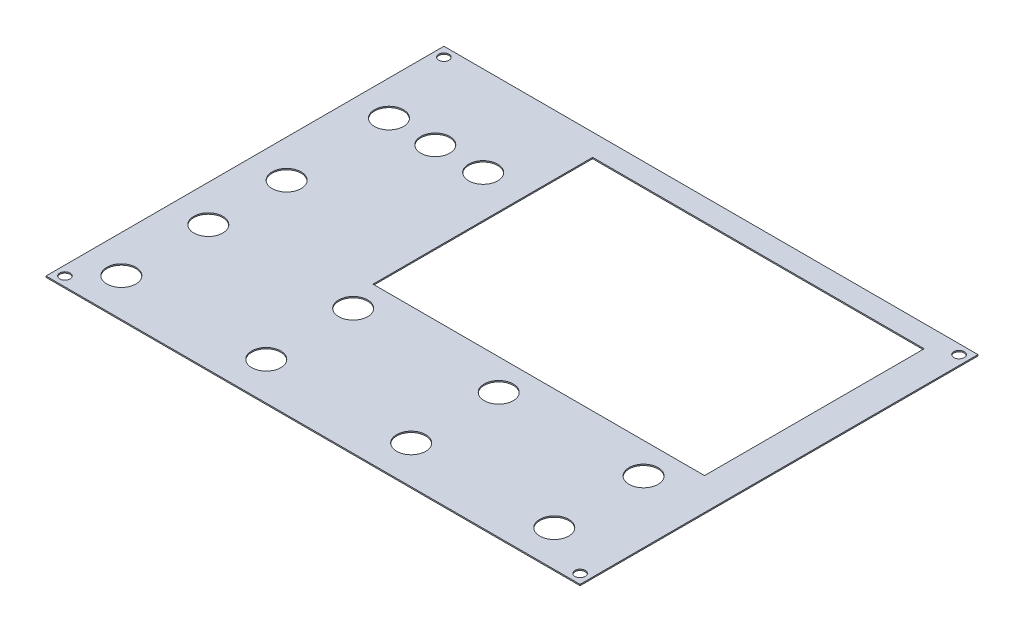
ISO-10303-21;
HEADER;
FILE_DESCRIPTION(('STEP AP214'),'2;1');
FILE_NAME('part.step','',(''),(''),'','','');
FILE_SCHEMA(('AUTOMOTIVE_DESIGN { 1 0 10303 214 1 1 1 1 }'));
ENDSEC;
DATA;
#1=APPLICATION_CONTEXT('core data for automotive mechanical design processes');
#2=APPLICATION_PROTOCOL_DEFINITION('international standard','automotive_design',2000,#1);
#3=PRODUCT_CONTEXT('',#1,'mechanical');
#4=PRODUCT('Part','Part','',(#3));
#5=PRODUCT_RELATED_PRODUCT_CATEGORY('part','',(#4));
#6=PRODUCT_DEFINITION_FORMATION('','',#4);
#7=PRODUCT_DEFINITION_CONTEXT('part definition',#1,'design');
#8=PRODUCT_DEFINITION('design','',#6,#7);
#9=PRODUCT_DEFINITION_SHAPE('','',#8);
#10=(LENGTH_UNIT() NAMED_UNIT(*) SI_UNIT(.MILLI.,.METRE.));
#11=(NAMED_UNIT(*) PLANE_ANGLE_UNIT() SI_UNIT($,.RADIAN.));
#12=(NAMED_UNIT(*) SI_UNIT($,.STERADIAN.) SOLID_ANGLE_UNIT());
#13=UNCERTAINTY_MEASURE_WITH_UNIT(LENGTH_MEASURE(1.E-05),#10,'distance_accuracy_value','');
#14=(GEOMETRIC_REPRESENTATION_CONTEXT(3) GLOBAL_UNCERTAINTY_ASSIGNED_CONTEXT((#13)) GLOBAL_UNIT_ASSIGNED_CONTEXT((#10,
#11,#12)) REPRESENTATION_CONTEXT('',''));
#15=CARTESIAN_POINT('',(0.,0.,0.));
#16=DIRECTION('',(0.,0.,1.));
#17=DIRECTION('',(1.,0.,0.));
#18=AXIS2_PLACEMENT_3D('',#15,#16,#17);
#19=CARTESIAN_POINT('',(0.,0.3,0.));
#20=DIRECTION('',(0.,-1.,0.));
#21=DIRECTION('',(0.,0.,-1.));
#22=AXIS2_PLACEMENT_3D('',#19,#20,#21);
#23=PLANE('',#22);
#24=CARTESIAN_POINT('',(28.83,0.3,-72.09));
#25=DIRECTION('',(0.,1.,0.));
#26=DIRECTION('',(0.,0.,1.));
#27=AXIS2_PLACEMENT_3D('',#24,#25,#26);
#28=CIRCLE('',#27,3.5);
#29=CARTESIAN_POINT('',(28.83,0.3,-68.59));
#30=VERTEX_POINT('',#29);
#31=EDGE_CURVE('E143',#30,#30,#28,.T.);
#32=ORIENTED_EDGE('',*,*,#31,.F.);
#33=EDGE_LOOP('',(#32));
#34=FACE_BOUND('',#33,.T.);
#35=CARTESIAN_POINT('',(17.272,0.3,-72.09));
#36=DIRECTION('',(0.,1.,0.));
#37=DIRECTION('',(0.,0.,1.));
#38=AXIS2_PLACEMENT_3D('',#35,#36,#37);
#39=CIRCLE('',#38,3.5);
#40=CARTESIAN_POINT('',(17.272,0.3,-68.59));
#41=VERTEX_POINT('',#40);
#42=EDGE_CURVE('E149',#41,#41,#39,.T.);
#43=ORIENTED_EDGE('',*,*,#42,.F.);
#44=EDGE_LOOP('',(#43));
#45=FACE_BOUND('',#44,.T.);
#46=CARTESIAN_POINT('',(6.09599999999999,0.3,-72.09));
#47=DIRECTION('',(0.,1.,0.));
#48=DIRECTION('',(0.,0.,1.));
#49=AXIS2_PLACEMENT_3D('',#46,#47,#48);
#50=CIRCLE('',#49,3.5);
#51=CARTESIAN_POINT('',(6.09599999999999,0.3,-68.59));
#52=VERTEX_POINT('',#51);
#53=EDGE_CURVE('E155',#52,#52,#50,.T.);
#54=ORIENTED_EDGE('',*,*,#53,.F.);
#55=EDGE_LOOP('',(#54));
#56=FACE_BOUND('',#55,.T.);
#57=CARTESIAN_POINT('',(111.601,0.3,-28.023));
#58=DIRECTION('',(0.,1.,0.));
#59=DIRECTION('',(0.,0.,1.));
#60=AXIS2_PLACEMENT_3D('',#57,#58,#59);
#61=CIRCLE('',#60,3.50000000000001);
#62=CARTESIAN_POINT('',(111.601,0.3,-24.523));
#63=VERTEX_POINT('',#62);
#64=EDGE_CURVE('E161',#63,#63,#61,.T.);
#65=ORIENTED_EDGE('',*,*,#64,.F.);
#66=EDGE_LOOP('',(#65));
#67=FACE_BOUND('',#66,.T.);
#68=CARTESIAN_POINT('',(76.645,0.3,-28.023));
#69=DIRECTION('',(0.,1.,0.));
#70=DIRECTION('',(0.,0.,1.));
#71=AXIS2_PLACEMENT_3D('',#68,#69,#70);
#72=CIRCLE('',#71,3.50000000000001);
#73=CARTESIAN_POINT('',(76.645,0.3,-24.523));
#74=VERTEX_POINT('',#73);
#75=EDGE_CURVE('E167',#74,#74,#72,.T.);
#76=ORIENTED_EDGE('',*,*,#75,.F.);
#77=EDGE_LOOP('',(#76));
#78=FACE_BOUND('',#77,.T.);
#79=CARTESIAN_POINT('',(41.524,0.3,-28.023));
#80=DIRECTION('',(0.,1.,0.));
#81=DIRECTION('',(0.,0.,1.));
#82=AXIS2_PLACEMENT_3D('',#79,#80,#81);
#83=CIRCLE('',#82,3.5);
#84=CARTESIAN_POINT('',(41.524,0.3,-24.523));
#85=VERTEX_POINT('',#84);
#86=EDGE_CURVE('E173',#85,#85,#83,.T.);
#87=ORIENTED_EDGE('',*,*,#86,.F.);
#88=EDGE_LOOP('',(#87));
#89=FACE_BOUND('',#88,.T.);
#90=CARTESIAN_POINT('',(6.56800000000001,0.3,-28.023));
#91=DIRECTION('',(0.,1.,0.));
#92=DIRECTION('',(0.,0.,1.));
#93=AXIS2_PLACEMENT_3D('',#90,#91,#92);
#94=CIRCLE('',#93,3.5);
#95=CARTESIAN_POINT('',(6.56800000000001,0.3,-24.523));
#96=VERTEX_POINT('',#95);
#97=EDGE_CURVE('E179',#96,#96,#94,.T.);
#98=ORIENTED_EDGE('',*,*,#97,.F.);
#99=EDGE_LOOP('',(#98));
#100=FACE_BOUND('',#99,.T.);
#101=CARTESIAN_POINT('',(6.73,0.3,-46.754));
#102=DIRECTION('',(0.,1.,0.));
#103=DIRECTION('',(0.,0.,1.));
#104=AXIS2_PLACEMENT_3D('',#101,#102,#103);
#105=CIRCLE('',#104,3.5);
#106=CARTESIAN_POINT('',(6.73,0.3,-43.254));
#107=VERTEX_POINT('',#106);
#108=EDGE_CURVE('E185',#107,#107,#105,.T.);
#109=ORIENTED_EDGE('',*,*,#108,.F.);
#110=EDGE_LOOP('',(#109));
#111=FACE_BOUND('',#110,.T.);
#112=CARTESIAN_POINT('',(111.63,0.3,-6.44));
#113=DIRECTION('',(0.,1.,0.));
#114=DIRECTION('',(0.,0.,1.));
#115=AXIS2_PLACEMENT_3D('',#112,#113,#114);
#116=CIRCLE('',#115,3.50000000000001);
#117=CARTESIAN_POINT('',(111.63,0.3,-2.93999999999999));
#118=VERTEX_POINT('',#117);
#119=EDGE_CURVE('E191',#118,#118,#116,.T.);
#120=ORIENTED_EDGE('',*,*,#119,.F.);
#121=EDGE_LOOP('',(#120));
#122=FACE_BOUND('',#121,.T.);
#123=CARTESIAN_POINT('',(76.663,0.3,-6.881));
#124=DIRECTION('',(0.,1.,0.));
#125=DIRECTION('',(0.,0.,1.));
#126=AXIS2_PLACEMENT_3D('',#123,#124,#125);
#127=CIRCLE('',#126,3.50000000000001);
#128=CARTESIAN_POINT('',(76.663,0.3,-3.38099999999999));
#129=VERTEX_POINT('',#128);
#130=EDGE_CURVE('E197',#129,#129,#127,.T.);
#131=ORIENTED_EDGE('',*,*,#130,.F.);
#132=EDGE_LOOP('',(#131));
#133=FACE_BOUND('',#132,.T.);
#134=CARTESIAN_POINT('',(41.697,0.3,-6.881));
#135=DIRECTION('',(0.,1.,0.));
#136=DIRECTION('',(0.,0.,1.));
#137=AXIS2_PLACEMENT_3D('',#134,#135,#136);
#138=CIRCLE('',#137,3.5);
#139=CARTESIAN_POINT('',(41.697,0.3,-3.381));
#140=VERTEX_POINT('',#139);
#141=EDGE_CURVE('E203',#140,#140,#138,.T.);
#142=ORIENTED_EDGE('',*,*,#141,.F.);
#143=EDGE_LOOP('',(#142));
#144=FACE_BOUND('',#143,.T.);
#145=CARTESIAN_POINT('',(6.731,0.3,-6.881));
#146=DIRECTION('',(0.,1.,0.));
#147=DIRECTION('',(0.,0.,1.));
#148=AXIS2_PLACEMENT_3D('',#145,#146,#147);
#149=CIRCLE('',#148,3.5);
#150=CARTESIAN_POINT('',(6.731,0.3,-3.381));
#151=VERTEX_POINT('',#150);
#152=EDGE_CURVE('E209',#151,#151,#149,.T.);
#153=ORIENTED_EDGE('',*,*,#152,.F.);
#154=EDGE_LOOP('',(#153));
#155=FACE_BOUND('',#154,.T.);
#156=CARTESIAN_POINT('',(124.3,0.3,0.));
#157=DIRECTION('',(0.,1.,0.));
#158=DIRECTION('',(0.,0.,1.));
#159=AXIS2_PLACEMENT_3D('',#156,#157,#158);
#160=CIRCLE('',#159,1.25000000000001);
#161=CARTESIAN_POINT('',(124.3,0.3,1.25000000000001));
#162=VERTEX_POINT('',#161);
#163=EDGE_CURVE('E215',#162,#162,#160,.T.);
#164=ORIENTED_EDGE('',*,*,#163,.F.);
#165=EDGE_LOOP('',(#164));
#166=FACE_BOUND('',#165,.T.);
#167=CARTESIAN_POINT('',(0.,0.3,0.));
#168=DIRECTION('',(0.,1.,0.));
#169=DIRECTION('',(0.,0.,1.));
#170=AXIS2_PLACEMENT_3D('',#167,#168,#169);
#171=CIRCLE('',#170,1.25);
#172=CARTESIAN_POINT('',(0.,0.3,1.25));
#173=VERTEX_POINT('',#172);
#174=EDGE_CURVE('E221',#173,#173,#171,.T.);
#175=ORIENTED_EDGE('',*,*,#174,.F.);
#176=EDGE_LOOP('',(#175));
#177=FACE_BOUND('',#176,.T.);
#178=CARTESIAN_POINT('',(124.3,0.3,-91.44));
#179=DIRECTION('',(0.,1.,0.));
#180=DIRECTION('',(0.,0.,1.));
#181=AXIS2_PLACEMENT_3D('',#178,#179,#180);
#182=CIRCLE('',#181,1.25000000000001);
#183=CARTESIAN_POINT('',(124.3,0.3,-90.19));
#184=VERTEX_POINT('',#183);
#185=EDGE_CURVE('E227',#184,#184,#182,.T.);
#186=ORIENTED_EDGE('',*,*,#185,.F.);
#187=EDGE_LOOP('',(#186));
#188=FACE_BOUND('',#187,.T.);
#189=CARTESIAN_POINT('',(0.,0.3,-91.44));
#190=DIRECTION('',(0.,1.,0.));
#191=DIRECTION('',(0.,0.,1.));
#192=AXIS2_PLACEMENT_3D('',#189,#190,#191);
#193=CIRCLE('',#192,1.25);
#194=CARTESIAN_POINT('',(0.,0.3,-90.19));
#195=VERTEX_POINT('',#194);
#196=EDGE_CURVE('E233',#195,#195,#193,.T.);
#197=ORIENTED_EDGE('',*,*,#196,.F.);
#198=EDGE_LOOP('',(#197));
#199=FACE_BOUND('',#198,.T.);
#200=DIRECTION('',(0.,0.,1.));
#201=VECTOR('',#200,1.);
#202=CARTESIAN_POINT('',(-2.286,0.3,2.286));
#203=LINE('',#202,#201);
#204=CARTESIAN_POINT('',(-2.286,0.3,-93.726));
#205=VERTEX_POINT('',#204);
#206=CARTESIAN_POINT('',(-2.286,0.3,2.286));
#207=VERTEX_POINT('',#206);
#208=EDGE_CURVE('E239',#205,#207,#203,.T.);
#209=ORIENTED_EDGE('',*,*,#208,.T.);
#210=DIRECTION('',(1.,0.,0.));
#211=VECTOR('',#210,1.);
#212=CARTESIAN_POINT('',(-2.286,0.3,2.286));
#213=LINE('',#212,#211);
#214=CARTESIAN_POINT('',(126.586,0.3,2.286));
#215=VERTEX_POINT('',#214);
#216=EDGE_CURVE('E242',#207,#215,#213,.T.);
#217=ORIENTED_EDGE('',*,*,#216,.T.);
#218=DIRECTION('',(0.,0.,-1.));
#219=VECTOR('',#218,1.);
#220=CARTESIAN_POINT('',(126.586,0.3,2.286));
#221=LINE('',#220,#219);
#222=CARTESIAN_POINT('',(126.586,0.3,-93.726));
#223=VERTEX_POINT('',#222);
#224=EDGE_CURVE('E245',#215,#223,#221,.T.);
#225=ORIENTED_EDGE('',*,*,#224,.T.);
#226=DIRECTION('',(-1.,0.,0.));
#227=VECTOR('',#226,1.);
#228=CARTESIAN_POINT('',(-2.286,0.3,-93.726));
#229=LINE('',#228,#227);
#230=EDGE_CURVE('E247',#223,#205,#229,.T.);
#231=ORIENTED_EDGE('',*,*,#230,.T.);
#232=EDGE_LOOP('',(#209,#217,#225,#231));
#233=FACE_BOUND('',#232,.T.);
#234=DIRECTION('',(0.,0.,1.));
#235=VECTOR('',#234,1.);
#236=CARTESIAN_POINT('',(38.875410922835,0.3,-88.4519872714323));
#237=LINE('',#236,#235);
#238=CARTESIAN_POINT('',(38.875410922835,0.3,-88.4519872714323));
#239=VERTEX_POINT('',#238);
#240=CARTESIAN_POINT('',(38.875410922835,0.3,-35.4519872714323));
#241=VERTEX_POINT('',#240);
#242=EDGE_CURVE('E107',#239,#241,#237,.T.);
#243=ORIENTED_EDGE('',*,*,#242,.F.);
#244=DIRECTION('',(-1.,0.,0.));
#245=VECTOR('',#244,1.);
#246=CARTESIAN_POINT('',(38.875410922835,0.3,-88.4519872714323));
#247=LINE('',#246,#245);
#248=CARTESIAN_POINT('',(118.875410922835,0.3,-88.4519872714323));
#249=VERTEX_POINT('',#248);
#250=EDGE_CURVE('E129',#249,#239,#247,.T.);
#251=ORIENTED_EDGE('',*,*,#250,.F.);
#252=DIRECTION('',(0.,0.,-1.));
#253=VECTOR('',#252,1.);
#254=CARTESIAN_POINT('',(118.875410922835,0.3,-88.4519872714323));
#255=LINE('',#254,#253);
#256=CARTESIAN_POINT('',(118.875410922835,0.3,-35.4519872714323));
#257=VERTEX_POINT('',#256);
#258=EDGE_CURVE('E127',#257,#249,#255,.T.);
#259=ORIENTED_EDGE('',*,*,#258,.F.);
#260=DIRECTION('',(1.,0.,0.));
#261=VECTOR('',#260,1.);
#262=CARTESIAN_POINT('',(38.875410922835,0.3,-35.4519872714323));
#263=LINE('',#262,#261);
#264=EDGE_CURVE('E115',#241,#257,#263,.T.);
#265=ORIENTED_EDGE('',*,*,#264,.F.);
#266=EDGE_LOOP('',(#243,#251,#259,#265));
#267=FACE_BOUND('',#266,.T.);
#268=ADVANCED_FACE('F42',(#34,#45,#56,#67,#78,#89,#100,#111,#122,#133,#144,#155,#166,#177,#188,
#199,#233,#267),#23,.F.);
#269=CARTESIAN_POINT('',(0.,0.,0.));
#270=DIRECTION('',(0.,-1.,0.));
#271=DIRECTION('',(0.,0.,-1.));
#272=AXIS2_PLACEMENT_3D('',#269,#270,#271);
#273=PLANE('',#272);
#274=CARTESIAN_POINT('',(17.272,0.,-72.09));
#275=DIRECTION('',(0.,1.,0.));
#276=DIRECTION('',(0.,0.,1.));
#277=AXIS2_PLACEMENT_3D('',#274,#275,#276);
#278=CIRCLE('',#277,3.5);
#279=CARTESIAN_POINT('',(17.272,0.,-68.59));
#280=VERTEX_POINT('',#279);
#281=EDGE_CURVE('E146',#280,#280,#278,.T.);
#282=ORIENTED_EDGE('',*,*,#281,.T.);
#283=EDGE_LOOP('',(#282));
#284=FACE_BOUND('',#283,.T.);
#285=CARTESIAN_POINT('',(111.601,0.,-28.023));
#286=DIRECTION('',(0.,1.,0.));
#287=DIRECTION('',(0.,0.,1.));
#288=AXIS2_PLACEMENT_3D('',#285,#286,#287);
#289=CIRCLE('',#288,3.50000000000001);
#290=CARTESIAN_POINT('',(111.601,0.,-24.523));
#291=VERTEX_POINT('',#290);
#292=EDGE_CURVE('E158',#291,#291,#289,.T.);
#293=ORIENTED_EDGE('',*,*,#292,.T.);
#294=EDGE_LOOP('',(#293));
#295=FACE_BOUND('',#294,.T.);
#296=CARTESIAN_POINT('',(41.524,0.,-28.023));
#297=DIRECTION('',(0.,1.,0.));
#298=DIRECTION('',(0.,0.,1.));
#299=AXIS2_PLACEMENT_3D('',#296,#297,#298);
#300=CIRCLE('',#299,3.5);
#301=CARTESIAN_POINT('',(41.524,0.,-24.523));
#302=VERTEX_POINT('',#301);
#303=EDGE_CURVE('E170',#302,#302,#300,.T.);
#304=ORIENTED_EDGE('',*,*,#303,.T.);
#305=EDGE_LOOP('',(#304));
#306=FACE_BOUND('',#305,.T.);
#307=CARTESIAN_POINT('',(6.73,0.,-46.754));
#308=DIRECTION('',(0.,1.,0.));
#309=DIRECTION('',(0.,0.,1.));
#310=AXIS2_PLACEMENT_3D('',#307,#308,#309);
#311=CIRCLE('',#310,3.5);
#312=CARTESIAN_POINT('',(6.73,0.,-43.254));
#313=VERTEX_POINT('',#312);
#314=EDGE_CURVE('E182',#313,#313,#311,.T.);
#315=ORIENTED_EDGE('',*,*,#314,.T.);
#316=EDGE_LOOP('',(#315));
#317=FACE_BOUND('',#316,.T.);
#318=CARTESIAN_POINT('',(76.663,0.,-6.881));
#319=DIRECTION('',(0.,1.,0.));
#320=DIRECTION('',(0.,0.,1.));
#321=AXIS2_PLACEMENT_3D('',#318,#319,#320);
#322=CIRCLE('',#321,3.50000000000001);
#323=CARTESIAN_POINT('',(76.663,0.,-3.38099999999999));
#324=VERTEX_POINT('',#323);
#325=EDGE_CURVE('E194',#324,#324,#322,.T.);
#326=ORIENTED_EDGE('',*,*,#325,.T.);
#327=EDGE_LOOP('',(#326));
#328=FACE_BOUND('',#327,.T.);
#329=CARTESIAN_POINT('',(6.731,0.,-6.881));
#330=DIRECTION('',(0.,1.,0.));
#331=DIRECTION('',(0.,0.,1.));
#332=AXIS2_PLACEMENT_3D('',#329,#330,#331);
#333=CIRCLE('',#332,3.5);
#334=CARTESIAN_POINT('',(6.731,0.,-3.381));
#335=VERTEX_POINT('',#334);
#336=EDGE_CURVE('E206',#335,#335,#333,.T.);
#337=ORIENTED_EDGE('',*,*,#336,.T.);
#338=EDGE_LOOP('',(#337));
#339=FACE_BOUND('',#338,.T.);
#340=CARTESIAN_POINT('',(0.,0.,0.));
#341=DIRECTION('',(0.,1.,0.));
#342=DIRECTION('',(0.,0.,1.));
#343=AXIS2_PLACEMENT_3D('',#340,#341,#342);
#344=CIRCLE('',#343,1.25);
#345=CARTESIAN_POINT('',(0.,0.,1.25));
#346=VERTEX_POINT('',#345);
#347=EDGE_CURVE('E218',#346,#346,#344,.T.);
#348=ORIENTED_EDGE('',*,*,#347,.T.);
#349=EDGE_LOOP('',(#348));
#350=FACE_BOUND('',#349,.T.);
#351=CARTESIAN_POINT('',(0.,0.,-91.44));
#352=DIRECTION('',(0.,1.,0.));
#353=DIRECTION('',(0.,0.,1.));
#354=AXIS2_PLACEMENT_3D('',#351,#352,#353);
#355=CIRCLE('',#354,1.25);
#356=CARTESIAN_POINT('',(0.,0.,-90.19));
#357=VERTEX_POINT('',#356);
#358=EDGE_CURVE('E230',#357,#357,#355,.T.);
#359=ORIENTED_EDGE('',*,*,#358,.T.);
#360=EDGE_LOOP('',(#359));
#361=FACE_BOUND('',#360,.T.);
#362=DIRECTION('',(0.,0.,1.));
#363=VECTOR('',#362,1.);
#364=CARTESIAN_POINT('',(-2.286,0.,2.286));
#365=LINE('',#364,#363);
#366=CARTESIAN_POINT('',(-2.286,0.,-93.726));
#367=VERTEX_POINT('',#366);
#368=CARTESIAN_POINT('',(-2.286,0.,2.286));
#369=VERTEX_POINT('',#368);
#370=EDGE_CURVE('E236',#367,#369,#365,.T.);
#371=ORIENTED_EDGE('',*,*,#370,.F.);
#372=DIRECTION('',(-1.,0.,0.));
#373=VECTOR('',#372,1.);
#374=CARTESIAN_POINT('',(-2.286,0.,-93.726));
#375=LINE('',#374,#373);
#376=CARTESIAN_POINT('',(126.586,0.,-93.726));
#377=VERTEX_POINT('',#376);
#378=EDGE_CURVE('E243',#377,#367,#375,.T.);
#379=ORIENTED_EDGE('',*,*,#378,.F.);
#380=DIRECTION('',(0.,0.,-1.));
#381=VECTOR('',#380,1.);
#382=CARTESIAN_POINT('',(126.586,0.,2.286));
#383=LINE('',#382,#381);
#384=CARTESIAN_POINT('',(126.586,0.,2.286));
#385=VERTEX_POINT('',#384);
#386=EDGE_CURVE('E254',#385,#377,#383,.T.);
#387=ORIENTED_EDGE('',*,*,#386,.F.);
#388=DIRECTION('',(1.,0.,0.));
#389=VECTOR('',#388,1.);
#390=CARTESIAN_POINT('',(-2.286,0.,2.286));
#391=LINE('',#390,#389);
#392=EDGE_CURVE('E252',#369,#385,#391,.T.);
#393=ORIENTED_EDGE('',*,*,#392,.F.);
#394=EDGE_LOOP('',(#371,#379,#387,#393));
#395=FACE_BOUND('',#394,.T.);
#396=CARTESIAN_POINT('',(124.3,0.,-91.44));
#397=DIRECTION('',(0.,1.,0.));
#398=DIRECTION('',(0.,0.,1.));
#399=AXIS2_PLACEMENT_3D('',#396,#397,#398);
#400=CIRCLE('',#399,1.25000000000001);
#401=CARTESIAN_POINT('',(124.3,0.,-90.19));
#402=VERTEX_POINT('',#401);
#403=EDGE_CURVE('E224',#402,#402,#400,.T.);
#404=ORIENTED_EDGE('',*,*,#403,.T.);
#405=EDGE_LOOP('',(#404));
#406=FACE_BOUND('',#405,.T.);
#407=CARTESIAN_POINT('',(124.3,0.,0.));
#408=DIRECTION('',(0.,1.,0.));
#409=DIRECTION('',(0.,0.,1.));
#410=AXIS2_PLACEMENT_3D('',#407,#408,#409);
#411=CIRCLE('',#410,1.25000000000001);
#412=CARTESIAN_POINT('',(124.3,0.,1.25000000000001));
#413=VERTEX_POINT('',#412);
#414=EDGE_CURVE('E212',#413,#413,#411,.T.);
#415=ORIENTED_EDGE('',*,*,#414,.T.);
#416=EDGE_LOOP('',(#415));
#417=FACE_BOUND('',#416,.T.);
#418=CARTESIAN_POINT('',(41.697,0.,-6.881));
#419=DIRECTION('',(0.,1.,0.));
#420=DIRECTION('',(0.,0.,1.));
#421=AXIS2_PLACEMENT_3D('',#418,#419,#420);
#422=CIRCLE('',#421,3.5);
#423=CARTESIAN_POINT('',(41.697,0.,-3.381));
#424=VERTEX_POINT('',#423);
#425=EDGE_CURVE('E200',#424,#424,#422,.T.);
#426=ORIENTED_EDGE('',*,*,#425,.T.);
#427=EDGE_LOOP('',(#426));
#428=FACE_BOUND('',#427,.T.);
#429=CARTESIAN_POINT('',(111.63,0.,-6.44));
#430=DIRECTION('',(0.,1.,0.));
#431=DIRECTION('',(0.,0.,1.));
#432=AXIS2_PLACEMENT_3D('',#429,#430,#431);
#433=CIRCLE('',#432,3.50000000000001);
#434=CARTESIAN_POINT('',(111.63,0.,-2.93999999999999));
#435=VERTEX_POINT('',#434);
#436=EDGE_CURVE('E188',#435,#435,#433,.T.);
#437=ORIENTED_EDGE('',*,*,#436,.T.);
#438=EDGE_LOOP('',(#437));
#439=FACE_BOUND('',#438,.T.);
#440=CARTESIAN_POINT('',(6.56800000000001,0.,-28.023));
#441=DIRECTION('',(0.,1.,0.));
#442=DIRECTION('',(0.,0.,1.));
#443=AXIS2_PLACEMENT_3D('',#440,#441,#442);
#444=CIRCLE('',#443,3.5);
#445=CARTESIAN_POINT('',(6.56800000000001,0.,-24.523));
#446=VERTEX_POINT('',#445);
#447=EDGE_CURVE('E176',#446,#446,#444,.T.);
#448=ORIENTED_EDGE('',*,*,#447,.T.);
#449=EDGE_LOOP('',(#448));
#450=FACE_BOUND('',#449,.T.);
#451=CARTESIAN_POINT('',(76.645,0.,-28.023));
#452=DIRECTION('',(0.,1.,0.));
#453=DIRECTION('',(0.,0.,1.));
#454=AXIS2_PLACEMENT_3D('',#451,#452,#453);
#455=CIRCLE('',#454,3.50000000000001);
#456=CARTESIAN_POINT('',(76.645,0.,-24.523));
#457=VERTEX_POINT('',#456);
#458=EDGE_CURVE('E164',#457,#457,#455,.T.);
#459=ORIENTED_EDGE('',*,*,#458,.T.);
#460=EDGE_LOOP('',(#459));
#461=FACE_BOUND('',#460,.T.);
#462=CARTESIAN_POINT('',(6.09599999999999,0.,-72.09));
#463=DIRECTION('',(0.,1.,0.));
#464=DIRECTION('',(0.,0.,1.));
#465=AXIS2_PLACEMENT_3D('',#462,#463,#464);
#466=CIRCLE('',#465,3.5);
#467=CARTESIAN_POINT('',(6.09599999999999,0.,-68.59));
#468=VERTEX_POINT('',#467);
#469=EDGE_CURVE('E152',#468,#468,#466,.T.);
#470=ORIENTED_EDGE('',*,*,#469,.T.);
#471=EDGE_LOOP('',(#470));
#472=FACE_BOUND('',#471,.T.);
#473=CARTESIAN_POINT('',(28.83,0.,-72.09));
#474=DIRECTION('',(0.,1.,0.));
#475=DIRECTION('',(0.,0.,1.));
#476=AXIS2_PLACEMENT_3D('',#473,#474,#475);
#477=CIRCLE('',#476,3.5);
#478=CARTESIAN_POINT('',(28.83,0.,-68.59));
#479=VERTEX_POINT('',#478);
#480=EDGE_CURVE('E123',#479,#479,#477,.T.);
#481=ORIENTED_EDGE('',*,*,#480,.T.);
#482=EDGE_LOOP('',(#481));
#483=FACE_BOUND('',#482,.T.);
#484=DIRECTION('',(-1.,0.,0.));
#485=VECTOR('',#484,1.);
#486=CARTESIAN_POINT('',(38.875410922835,0.,-88.4519872714323));
#487=LINE('',#486,#485);
#488=CARTESIAN_POINT('',(118.875410922835,0.,-88.4519872714323));
#489=VERTEX_POINT('',#488);
#490=CARTESIAN_POINT('',(38.875410922835,0.,-88.4519872714323));
#491=VERTEX_POINT('',#490);
#492=EDGE_CURVE('E116',#489,#491,#487,.T.);
#493=ORIENTED_EDGE('',*,*,#492,.T.);
#494=DIRECTION('',(0.,0.,1.));
#495=VECTOR('',#494,1.);
#496=CARTESIAN_POINT('',(38.875410922835,0.,-88.4519872714323));
#497=LINE('',#496,#495);
#498=CARTESIAN_POINT('',(38.875410922835,0.,-35.4519872714323));
#499=VERTEX_POINT('',#498);
#500=EDGE_CURVE('E65',#491,#499,#497,.T.);
#501=ORIENTED_EDGE('',*,*,#500,.T.);
#502=DIRECTION('',(1.,0.,0.));
#503=VECTOR('',#502,1.);
#504=CARTESIAN_POINT('',(38.875410922835,0.,-35.4519872714323));
#505=LINE('',#504,#503);
#506=CARTESIAN_POINT('',(118.875410922835,0.,-35.4519872714323));
#507=VERTEX_POINT('',#506);
#508=EDGE_CURVE('E122',#499,#507,#505,.T.);
#509=ORIENTED_EDGE('',*,*,#508,.T.);
#510=DIRECTION('',(0.,0.,-1.));
#511=VECTOR('',#510,1.);
#512=CARTESIAN_POINT('',(118.875410922835,0.,-88.4519872714323));
#513=LINE('',#512,#511);
#514=EDGE_CURVE('E135',#507,#489,#513,.T.);
#515=ORIENTED_EDGE('',*,*,#514,.T.);
#516=EDGE_LOOP('',(#493,#501,#509,#515));
#517=FACE_BOUND('',#516,.T.);
#518=ADVANCED_FACE('F272',(#284,#295,#306,#317,#328,#339,#350,#361,#395,#406,#417,#428,#439,
#450,#461,#472,#483,#517),#273,.T.);
#519=CARTESIAN_POINT('',(-2.286,0.3,2.286));
#520=DIRECTION('',(1.,0.,0.));
#521=DIRECTION('',(0.,0.,-1.));
#522=AXIS2_PLACEMENT_3D('',#519,#520,#521);
#523=PLANE('',#522);
#524=ORIENTED_EDGE('',*,*,#370,.T.);
#525=DIRECTION('',(0.,-1.,0.));
#526=VECTOR('',#525,1.);
#527=CARTESIAN_POINT('',(-2.286,0.3,2.286));
#528=LINE('',#527,#526);
#529=EDGE_CURVE('E11',#207,#369,#528,.T.);
#530=ORIENTED_EDGE('',*,*,#529,.F.);
#531=ORIENTED_EDGE('',*,*,#208,.F.);
#532=DIRECTION('',(0.,-1.,0.));
#533=VECTOR('',#532,1.);
#534=CARTESIAN_POINT('',(-2.286,0.3,-93.726));
#535=LINE('',#534,#533);
#536=EDGE_CURVE('E249',#205,#367,#535,.T.);
#537=ORIENTED_EDGE('',*,*,#536,.T.);
#538=EDGE_LOOP('',(#524,#530,#531,#537));
#539=FACE_BOUND('',#538,.T.);
#540=ADVANCED_FACE('F44',(#539),#523,.F.);
#541=CARTESIAN_POINT('',(-2.286,0.3,2.286));
#542=DIRECTION('',(0.,0.,-1.));
#543=DIRECTION('',(-1.,0.,0.));
#544=AXIS2_PLACEMENT_3D('',#541,#542,#543);
#545=PLANE('',#544);
#546=ORIENTED_EDGE('',*,*,#392,.T.);
#547=DIRECTION('',(0.,-1.,0.));
#548=VECTOR('',#547,1.);
#549=CARTESIAN_POINT('',(126.586,0.3,2.286));
#550=LINE('',#549,#548);
#551=EDGE_CURVE('E50',#215,#385,#550,.T.);
#552=ORIENTED_EDGE('',*,*,#551,.F.);
#553=ORIENTED_EDGE('',*,*,#216,.F.);
#554=ORIENTED_EDGE('',*,*,#529,.T.);
#555=EDGE_LOOP('',(#546,#552,#553,#554));
#556=FACE_BOUND('',#555,.T.);
#557=ADVANCED_FACE('F282',(#556),#545,.F.);
#558=CARTESIAN_POINT('',(126.586,0.3,2.286));
#559=DIRECTION('',(-1.,0.,0.));
#560=DIRECTION('',(0.,0.,1.));
#561=AXIS2_PLACEMENT_3D('',#558,#559,#560);
#562=PLANE('',#561);
#563=ORIENTED_EDGE('',*,*,#386,.T.);
#564=DIRECTION('',(0.,-1.,0.));
#565=VECTOR('',#564,1.);
#566=CARTESIAN_POINT('',(126.586,0.3,-93.726));
#567=LINE('',#566,#565);
#568=EDGE_CURVE('E259',#223,#377,#567,.T.);
#569=ORIENTED_EDGE('',*,*,#568,.F.);
#570=ORIENTED_EDGE('',*,*,#224,.F.);
#571=ORIENTED_EDGE('',*,*,#551,.T.);
#572=EDGE_LOOP('',(#563,#569,#570,#571));
#573=FACE_BOUND('',#572,.T.);
#574=ADVANCED_FACE('F266',(#573),#562,.F.);
#575=CARTESIAN_POINT('',(-2.286,0.3,-93.726));
#576=DIRECTION('',(0.,0.,1.));
#577=DIRECTION('',(1.,0.,0.));
#578=AXIS2_PLACEMENT_3D('',#575,#576,#577);
#579=PLANE('',#578);
#580=ORIENTED_EDGE('',*,*,#378,.T.);
#581=ORIENTED_EDGE('',*,*,#536,.F.);
#582=ORIENTED_EDGE('',*,*,#230,.F.);
#583=ORIENTED_EDGE('',*,*,#568,.T.);
#584=EDGE_LOOP('',(#580,#581,#582,#583));
#585=FACE_BOUND('',#584,.T.);
#586=ADVANCED_FACE('F276',(#585),#579,.F.);
#587=CARTESIAN_POINT('',(0.,0.3,-91.44));
#588=DIRECTION('',(0.,-1.,0.));
#589=DIRECTION('',(0.,0.,-1.));
#590=AXIS2_PLACEMENT_3D('',#587,#588,#589);
#591=CYLINDRICAL_SURFACE('',#590,1.25);
#592=ORIENTED_EDGE('',*,*,#196,.T.);
#593=EDGE_LOOP('',(#592));
#594=FACE_BOUND('',#593,.T.);
#595=ORIENTED_EDGE('',*,*,#358,.F.);
#596=EDGE_LOOP('',(#595));
#597=FACE_BOUND('',#596,.T.);
#598=ADVANCED_FACE('F300',(#594,#597),#591,.F.);
#599=CARTESIAN_POINT('',(124.3,0.3,-91.44));
#600=DIRECTION('',(0.,-1.,0.));
#601=DIRECTION('',(0.,0.,-1.));
#602=AXIS2_PLACEMENT_3D('',#599,#600,#601);
#603=CYLINDRICAL_SURFACE('',#602,1.25000000000001);
#604=ORIENTED_EDGE('',*,*,#185,.T.);
#605=EDGE_LOOP('',(#604));
#606=FACE_BOUND('',#605,.T.);
#607=ORIENTED_EDGE('',*,*,#403,.F.);
#608=EDGE_LOOP('',(#607));
#609=FACE_BOUND('',#608,.T.);
#610=ADVANCED_FACE('F307',(#606,#609),#603,.F.);
#611=CARTESIAN_POINT('',(0.,0.3,0.));
#612=DIRECTION('',(0.,-1.,0.));
#613=DIRECTION('',(0.,0.,-1.));
#614=AXIS2_PLACEMENT_3D('',#611,#612,#613);
#615=CYLINDRICAL_SURFACE('',#614,1.25);
#616=ORIENTED_EDGE('',*,*,#174,.T.);
#617=EDGE_LOOP('',(#616));
#618=FACE_BOUND('',#617,.T.);
#619=ORIENTED_EDGE('',*,*,#347,.F.);
#620=EDGE_LOOP('',(#619));
#621=FACE_BOUND('',#620,.T.);
#622=ADVANCED_FACE('F312',(#618,#621),#615,.F.);
#623=CARTESIAN_POINT('',(124.3,0.3,0.));
#624=DIRECTION('',(0.,-1.,0.));
#625=DIRECTION('',(0.,0.,-1.));
#626=AXIS2_PLACEMENT_3D('',#623,#624,#625);
#627=CYLINDRICAL_SURFACE('',#626,1.25000000000001);
#628=ORIENTED_EDGE('',*,*,#163,.T.);
#629=EDGE_LOOP('',(#628));
#630=FACE_BOUND('',#629,.T.);
#631=ORIENTED_EDGE('',*,*,#414,.F.);
#632=EDGE_LOOP('',(#631));
#633=FACE_BOUND('',#632,.T.);
#634=ADVANCED_FACE('F322',(#630,#633),#627,.F.);
#635=CARTESIAN_POINT('',(6.731,0.3,-6.881));
#636=DIRECTION('',(0.,-1.,0.));
#637=DIRECTION('',(0.,0.,-1.));
#638=AXIS2_PLACEMENT_3D('',#635,#636,#637);
#639=CYLINDRICAL_SURFACE('',#638,3.5);
#640=ORIENTED_EDGE('',*,*,#152,.T.);
#641=EDGE_LOOP('',(#640));
#642=FACE_BOUND('',#641,.T.);
#643=ORIENTED_EDGE('',*,*,#336,.F.);
#644=EDGE_LOOP('',(#643));
#645=FACE_BOUND('',#644,.T.);
#646=ADVANCED_FACE('F329',(#642,#645),#639,.F.);
#647=CARTESIAN_POINT('',(41.697,0.3,-6.881));
#648=DIRECTION('',(0.,-1.,0.));
#649=DIRECTION('',(0.,0.,-1.));
#650=AXIS2_PLACEMENT_3D('',#647,#648,#649);
#651=CYLINDRICAL_SURFACE('',#650,3.5);
#652=ORIENTED_EDGE('',*,*,#141,.T.);
#653=EDGE_LOOP('',(#652));
#654=FACE_BOUND('',#653,.T.);
#655=ORIENTED_EDGE('',*,*,#425,.F.);
#656=EDGE_LOOP('',(#655));
#657=FACE_BOUND('',#656,.T.);
#658=ADVANCED_FACE('F333',(#654,#657),#651,.F.);
#659=CARTESIAN_POINT('',(76.663,0.3,-6.881));
#660=DIRECTION('',(0.,-1.,0.));
#661=DIRECTION('',(0.,0.,-1.));
#662=AXIS2_PLACEMENT_3D('',#659,#660,#661);
#663=CYLINDRICAL_SURFACE('',#662,3.50000000000001);
#664=ORIENTED_EDGE('',*,*,#130,.T.);
#665=EDGE_LOOP('',(#664));
#666=FACE_BOUND('',#665,.T.);
#667=ORIENTED_EDGE('',*,*,#325,.F.);
#668=EDGE_LOOP('',(#667));
#669=FACE_BOUND('',#668,.T.);
#670=ADVANCED_FACE('F337',(#666,#669),#663,.F.);
#671=CARTESIAN_POINT('',(111.63,0.3,-6.44));
#672=DIRECTION('',(0.,-1.,0.));
#673=DIRECTION('',(0.,0.,-1.));
#674=AXIS2_PLACEMENT_3D('',#671,#672,#673);
#675=CYLINDRICAL_SURFACE('',#674,3.50000000000001);
#676=ORIENTED_EDGE('',*,*,#119,.T.);
#677=EDGE_LOOP('',(#676));
#678=FACE_BOUND('',#677,.T.);
#679=ORIENTED_EDGE('',*,*,#436,.F.);
#680=EDGE_LOOP('',(#679));
#681=FACE_BOUND('',#680,.T.);
#682=ADVANCED_FACE('F341',(#678,#681),#675,.F.);
#683=CARTESIAN_POINT('',(6.73,0.3,-46.754));
#684=DIRECTION('',(0.,-1.,0.));
#685=DIRECTION('',(0.,0.,-1.));
#686=AXIS2_PLACEMENT_3D('',#683,#684,#685);
#687=CYLINDRICAL_SURFACE('',#686,3.5);
#688=ORIENTED_EDGE('',*,*,#108,.T.);
#689=EDGE_LOOP('',(#688));
#690=FACE_BOUND('',#689,.T.);
#691=ORIENTED_EDGE('',*,*,#314,.F.);
#692=EDGE_LOOP('',(#691));
#693=FACE_BOUND('',#692,.T.);
#694=ADVANCED_FACE('F345',(#690,#693),#687,.F.);
#695=CARTESIAN_POINT('',(6.56800000000001,0.3,-28.023));
#696=DIRECTION('',(0.,-1.,0.));
#697=DIRECTION('',(0.,0.,-1.));
#698=AXIS2_PLACEMENT_3D('',#695,#696,#697);
#699=CYLINDRICAL_SURFACE('',#698,3.5);
#700=ORIENTED_EDGE('',*,*,#97,.T.);
#701=EDGE_LOOP('',(#700));
#702=FACE_BOUND('',#701,.T.);
#703=ORIENTED_EDGE('',*,*,#447,.F.);
#704=EDGE_LOOP('',(#703));
#705=FACE_BOUND('',#704,.T.);
#706=ADVANCED_FACE('F349',(#702,#705),#699,.F.);
#707=CARTESIAN_POINT('',(41.524,0.3,-28.023));
#708=DIRECTION('',(0.,-1.,0.));
#709=DIRECTION('',(0.,0.,-1.));
#710=AXIS2_PLACEMENT_3D('',#707,#708,#709);
#711=CYLINDRICAL_SURFACE('',#710,3.5);
#712=ORIENTED_EDGE('',*,*,#86,.T.);
#713=EDGE_LOOP('',(#712));
#714=FACE_BOUND('',#713,.T.);
#715=ORIENTED_EDGE('',*,*,#303,.F.);
#716=EDGE_LOOP('',(#715));
#717=FACE_BOUND('',#716,.T.);
#718=ADVANCED_FACE('F353',(#714,#717),#711,.F.);
#719=CARTESIAN_POINT('',(76.645,0.3,-28.023));
#720=DIRECTION('',(0.,-1.,0.));
#721=DIRECTION('',(0.,0.,-1.));
#722=AXIS2_PLACEMENT_3D('',#719,#720,#721);
#723=CYLINDRICAL_SURFACE('',#722,3.50000000000001);
#724=ORIENTED_EDGE('',*,*,#75,.T.);
#725=EDGE_LOOP('',(#724));
#726=FACE_BOUND('',#725,.T.);
#727=ORIENTED_EDGE('',*,*,#458,.F.);
#728=EDGE_LOOP('',(#727));
#729=FACE_BOUND('',#728,.T.);
#730=ADVANCED_FACE('F357',(#726,#729),#723,.F.);
#731=CARTESIAN_POINT('',(111.601,0.3,-28.023));
#732=DIRECTION('',(0.,-1.,0.));
#733=DIRECTION('',(0.,0.,-1.));
#734=AXIS2_PLACEMENT_3D('',#731,#732,#733);
#735=CYLINDRICAL_SURFACE('',#734,3.50000000000001);
#736=ORIENTED_EDGE('',*,*,#64,.T.);
#737=EDGE_LOOP('',(#736));
#738=FACE_BOUND('',#737,.T.);
#739=ORIENTED_EDGE('',*,*,#292,.F.);
#740=EDGE_LOOP('',(#739));
#741=FACE_BOUND('',#740,.T.);
#742=ADVANCED_FACE('F361',(#738,#741),#735,.F.);
#743=CARTESIAN_POINT('',(6.09599999999999,0.3,-72.09));
#744=DIRECTION('',(0.,-1.,0.));
#745=DIRECTION('',(0.,0.,-1.));
#746=AXIS2_PLACEMENT_3D('',#743,#744,#745);
#747=CYLINDRICAL_SURFACE('',#746,3.5);
#748=ORIENTED_EDGE('',*,*,#53,.T.);
#749=EDGE_LOOP('',(#748));
#750=FACE_BOUND('',#749,.T.);
#751=ORIENTED_EDGE('',*,*,#469,.F.);
#752=EDGE_LOOP('',(#751));
#753=FACE_BOUND('',#752,.T.);
#754=ADVANCED_FACE('F365',(#750,#753),#747,.F.);
#755=CARTESIAN_POINT('',(17.272,0.3,-72.09));
#756=DIRECTION('',(0.,-1.,0.));
#757=DIRECTION('',(0.,0.,-1.));
#758=AXIS2_PLACEMENT_3D('',#755,#756,#757);
#759=CYLINDRICAL_SURFACE('',#758,3.5);
#760=ORIENTED_EDGE('',*,*,#42,.T.);
#761=EDGE_LOOP('',(#760));
#762=FACE_BOUND('',#761,.T.);
#763=ORIENTED_EDGE('',*,*,#281,.F.);
#764=EDGE_LOOP('',(#763));
#765=FACE_BOUND('',#764,.T.);
#766=ADVANCED_FACE('F369',(#762,#765),#759,.F.);
#767=CARTESIAN_POINT('',(28.83,0.3,-72.09));
#768=DIRECTION('',(0.,-1.,0.));
#769=DIRECTION('',(0.,0.,-1.));
#770=AXIS2_PLACEMENT_3D('',#767,#768,#769);
#771=CYLINDRICAL_SURFACE('',#770,3.5);
#772=ORIENTED_EDGE('',*,*,#31,.T.);
#773=EDGE_LOOP('',(#772));
#774=FACE_BOUND('',#773,.T.);
#775=ORIENTED_EDGE('',*,*,#480,.F.);
#776=EDGE_LOOP('',(#775));
#777=FACE_BOUND('',#776,.T.);
#778=ADVANCED_FACE('F373',(#774,#777),#771,.F.);
#779=CARTESIAN_POINT('',(38.875410922835,0.3,-88.4519872714323));
#780=DIRECTION('',(1.,0.,0.));
#781=DIRECTION('',(0.,0.,-1.));
#782=AXIS2_PLACEMENT_3D('',#779,#780,#781);
#783=PLANE('',#782);
#784=ORIENTED_EDGE('',*,*,#500,.F.);
#785=DIRECTION('',(0.,-1.,0.));
#786=VECTOR('',#785,1.);
#787=CARTESIAN_POINT('',(38.875410922835,0.3,-88.4519872714323));
#788=LINE('',#787,#786);
#789=EDGE_CURVE('E111',#239,#491,#788,.T.);
#790=ORIENTED_EDGE('',*,*,#789,.F.);
#791=ORIENTED_EDGE('',*,*,#242,.T.);
#792=DIRECTION('',(0.,-1.,0.));
#793=VECTOR('',#792,1.);
#794=CARTESIAN_POINT('',(38.875410922835,0.3,-35.4519872714323));
#795=LINE('',#794,#793);
#796=EDGE_CURVE('E110',#241,#499,#795,.T.);
#797=ORIENTED_EDGE('',*,*,#796,.T.);
#798=EDGE_LOOP('',(#784,#790,#791,#797));
#799=FACE_BOUND('',#798,.T.);
#800=ADVANCED_FACE('F109',(#799),#783,.T.);
#801=CARTESIAN_POINT('',(38.875410922835,0.3,-35.4519872714323));
#802=DIRECTION('',(0.,0.,-1.));
#803=DIRECTION('',(-1.,0.,0.));
#804=AXIS2_PLACEMENT_3D('',#801,#802,#803);
#805=PLANE('',#804);
#806=ORIENTED_EDGE('',*,*,#508,.F.);
#807=ORIENTED_EDGE('',*,*,#796,.F.);
#808=ORIENTED_EDGE('',*,*,#264,.T.);
#809=DIRECTION('',(0.,-1.,0.));
#810=VECTOR('',#809,1.);
#811=CARTESIAN_POINT('',(118.875410922835,0.3,-35.4519872714323));
#812=LINE('',#811,#810);
#813=EDGE_CURVE('E124',#257,#507,#812,.T.);
#814=ORIENTED_EDGE('',*,*,#813,.T.);
#815=EDGE_LOOP('',(#806,#807,#808,#814));
#816=FACE_BOUND('',#815,.T.);
#817=ADVANCED_FACE('F119',(#816),#805,.T.);
#818=CARTESIAN_POINT('',(118.875410922835,0.3,-88.4519872714323));
#819=DIRECTION('',(-1.,0.,0.));
#820=DIRECTION('',(0.,0.,1.));
#821=AXIS2_PLACEMENT_3D('',#818,#819,#820);
#822=PLANE('',#821);
#823=ORIENTED_EDGE('',*,*,#514,.F.);
#824=ORIENTED_EDGE('',*,*,#813,.F.);
#825=ORIENTED_EDGE('',*,*,#258,.T.);
#826=DIRECTION('',(0.,-1.,0.));
#827=VECTOR('',#826,1.);
#828=CARTESIAN_POINT('',(118.875410922835,0.3,-88.4519872714323));
#829=LINE('',#828,#827);
#830=EDGE_CURVE('E57',#249,#489,#829,.T.);
#831=ORIENTED_EDGE('',*,*,#830,.T.);
#832=EDGE_LOOP('',(#823,#824,#825,#831));
#833=FACE_BOUND('',#832,.T.);
#834=ADVANCED_FACE('F382',(#833),#822,.T.);
#835=CARTESIAN_POINT('',(38.875410922835,0.3,-88.4519872714323));
#836=DIRECTION('',(0.,0.,1.));
#837=DIRECTION('',(1.,0.,0.));
#838=AXIS2_PLACEMENT_3D('',#835,#836,#837);
#839=PLANE('',#838);
#840=ORIENTED_EDGE('',*,*,#492,.F.);
#841=ORIENTED_EDGE('',*,*,#830,.F.);
#842=ORIENTED_EDGE('',*,*,#250,.T.);
#843=ORIENTED_EDGE('',*,*,#789,.T.);
#844=EDGE_LOOP('',(#840,#841,#842,#843));
#845=FACE_BOUND('',#844,.T.);
#846=ADVANCED_FACE('F385',(#845),#839,.T.);
#847=CLOSED_SHELL('',(#268,#518,#540,#557,#574,#586,#598,#610,#622,#634,#646,#658,#670,#682,
#694,#706,#718,#730,#742,#754,#766,#778,#800,#817,#834,#846));
#848=MANIFOLD_SOLID_BREP('B2',#847);
#849=ADVANCED_BREP_SHAPE_REPRESENTATION('',(#18,#848),#14);
#850=SHAPE_DEFINITION_REPRESENTATION(#9,#849);
ENDSEC;
END-ISO-10303-21;
